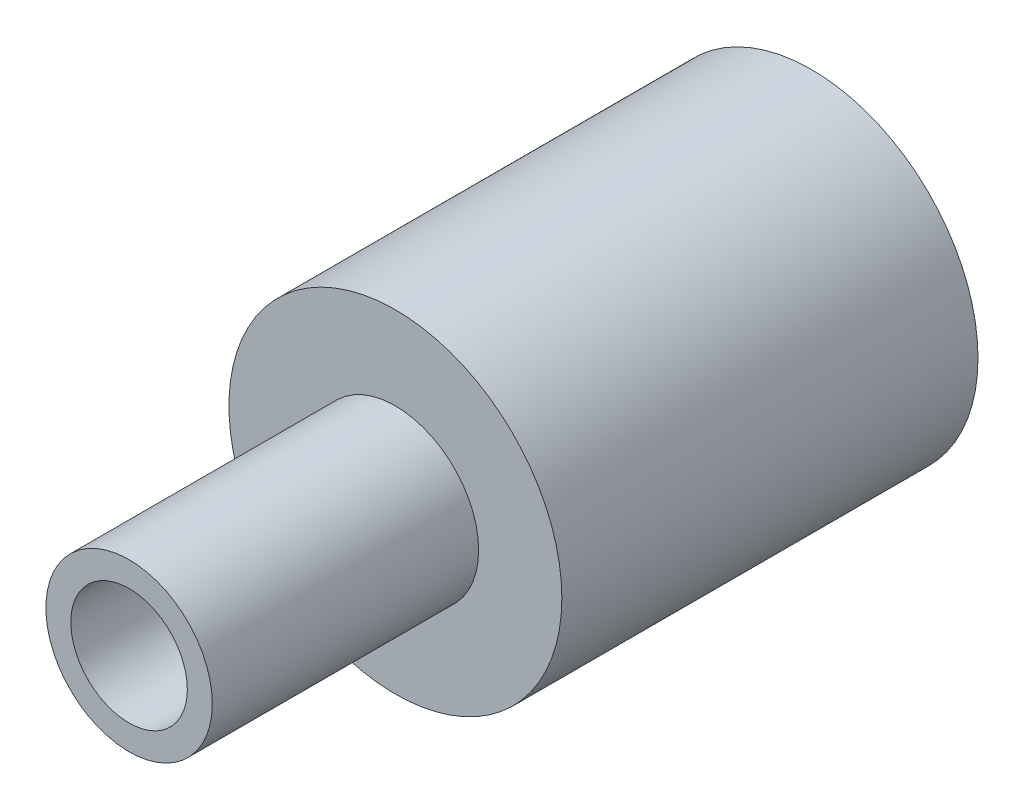
ISO-10303-21;
HEADER;
FILE_DESCRIPTION(('STEP AP214'),'2;1');
FILE_NAME('part.step','',(''),(''),'','','');
FILE_SCHEMA(('AUTOMOTIVE_DESIGN { 1 0 10303 214 1 1 1 1 }'));
ENDSEC;
DATA;
#1=APPLICATION_CONTEXT('core data for automotive mechanical design processes');
#2=APPLICATION_PROTOCOL_DEFINITION('international standard','automotive_design',2000,#1);
#3=PRODUCT_CONTEXT('',#1,'mechanical');
#4=PRODUCT('Part','Part','',(#3));
#5=PRODUCT_RELATED_PRODUCT_CATEGORY('part','',(#4));
#6=PRODUCT_DEFINITION_FORMATION('','',#4);
#7=PRODUCT_DEFINITION_CONTEXT('part definition',#1,'design');
#8=PRODUCT_DEFINITION('design','',#6,#7);
#9=PRODUCT_DEFINITION_SHAPE('','',#8);
#10=(LENGTH_UNIT() NAMED_UNIT(*) SI_UNIT(.MILLI.,.METRE.));
#11=(NAMED_UNIT(*) PLANE_ANGLE_UNIT() SI_UNIT($,.RADIAN.));
#12=(NAMED_UNIT(*) SI_UNIT($,.STERADIAN.) SOLID_ANGLE_UNIT());
#13=UNCERTAINTY_MEASURE_WITH_UNIT(LENGTH_MEASURE(1.E-05),#10,'distance_accuracy_value','');
#14=(GEOMETRIC_REPRESENTATION_CONTEXT(3) GLOBAL_UNCERTAINTY_ASSIGNED_CONTEXT((#13)) GLOBAL_UNIT_ASSIGNED_CONTEXT((#10,
#11,#12)) REPRESENTATION_CONTEXT('',''));
#15=CARTESIAN_POINT('',(0.,0.,0.));
#16=DIRECTION('',(0.,0.,1.));
#17=DIRECTION('',(1.,0.,0.));
#18=AXIS2_PLACEMENT_3D('',#15,#16,#17);
#19=CARTESIAN_POINT('',(0.,0.,41.));
#20=DIRECTION('',(0.,0.,-1.));
#21=DIRECTION('',(-1.,0.,0.));
#22=AXIS2_PLACEMENT_3D('',#19,#20,#21);
#23=CYLINDRICAL_SURFACE('',#22,10.);
#24=CARTESIAN_POINT('',(0.,0.,0.));
#25=DIRECTION('',(0.,0.,1.));
#26=DIRECTION('',(1.,0.,0.));
#27=AXIS2_PLACEMENT_3D('',#24,#25,#26);
#28=CIRCLE('',#27,10.);
#29=CARTESIAN_POINT('',(10.,0.,0.));
#30=VERTEX_POINT('',#29);
#31=EDGE_CURVE('E11',#30,#30,#28,.T.);
#32=ORIENTED_EDGE('',*,*,#31,.T.);
#33=EDGE_LOOP('',(#32));
#34=FACE_BOUND('',#33,.T.);
#35=CARTESIAN_POINT('',(0.,0.,25.));
#36=DIRECTION('',(0.,0.,1.));
#37=DIRECTION('',(1.,0.,0.));
#38=AXIS2_PLACEMENT_3D('',#35,#36,#37);
#39=CIRCLE('',#38,10.);
#40=CARTESIAN_POINT('',(10.,0.,25.));
#41=VERTEX_POINT('',#40);
#42=EDGE_CURVE('E38',#41,#41,#39,.T.);
#43=ORIENTED_EDGE('',*,*,#42,.F.);
#44=EDGE_LOOP('',(#43));
#45=FACE_BOUND('',#44,.T.);
#46=ADVANCED_FACE('F35',(#34,#45),#23,.T.);
#47=CARTESIAN_POINT('',(0.,0.,0.));
#48=DIRECTION('',(0.,0.,1.));
#49=DIRECTION('',(1.,0.,0.));
#50=AXIS2_PLACEMENT_3D('',#47,#48,#49);
#51=PLANE('',#50);
#52=CARTESIAN_POINT('',(0.,0.,0.));
#53=DIRECTION('',(0.,0.,-1.));
#54=DIRECTION('',(-1.,0.,0.));
#55=AXIS2_PLACEMENT_3D('',#52,#53,#54);
#56=CIRCLE('',#55,5.);
#57=CARTESIAN_POINT('',(-5.,0.,0.));
#58=VERTEX_POINT('',#57);
#59=EDGE_CURVE('E46',#58,#58,#56,.T.);
#60=ORIENTED_EDGE('',*,*,#59,.F.);
#61=EDGE_LOOP('',(#60));
#62=FACE_BOUND('',#61,.T.);
#63=ORIENTED_EDGE('',*,*,#31,.F.);
#64=EDGE_LOOP('',(#63));
#65=FACE_BOUND('',#64,.T.);
#66=ADVANCED_FACE('F90',(#62,#65),#51,.F.);
#67=CARTESIAN_POINT('',(0.,0.,10.));
#68=DIRECTION('',(0.,0.,-1.));
#69=DIRECTION('',(-1.,0.,0.));
#70=AXIS2_PLACEMENT_3D('',#67,#68,#69);
#71=CYLINDRICAL_SURFACE('',#70,5.);
#72=CARTESIAN_POINT('',(0.,0.,10.));
#73=DIRECTION('',(0.,0.,-1.));
#74=DIRECTION('',(-1.,0.,0.));
#75=AXIS2_PLACEMENT_3D('',#72,#73,#74);
#76=CIRCLE('',#75,5.);
#77=CARTESIAN_POINT('',(-5.,0.,10.));
#78=VERTEX_POINT('',#77);
#79=EDGE_CURVE('E42',#78,#78,#76,.T.);
#80=ORIENTED_EDGE('',*,*,#79,.F.);
#81=EDGE_LOOP('',(#80));
#82=FACE_BOUND('',#81,.T.);
#83=ORIENTED_EDGE('',*,*,#59,.T.);
#84=EDGE_LOOP('',(#83));
#85=FACE_BOUND('',#84,.T.);
#86=ADVANCED_FACE('F94',(#82,#85),#71,.F.);
#87=CARTESIAN_POINT('',(0.,0.,10.));
#88=DIRECTION('',(0.,0.,-1.));
#89=DIRECTION('',(-1.,0.,0.));
#90=AXIS2_PLACEMENT_3D('',#87,#88,#89);
#91=PLANE('',#90);
#92=ORIENTED_EDGE('',*,*,#79,.T.);
#93=EDGE_LOOP('',(#92));
#94=FACE_BOUND('',#93,.T.);
#95=ADVANCED_FACE('F86',(#94),#91,.T.);
#96=CARTESIAN_POINT('',(0.,0.,25.));
#97=DIRECTION('',(0.,0.,1.));
#98=DIRECTION('',(1.,0.,0.));
#99=AXIS2_PLACEMENT_3D('',#96,#97,#98);
#100=PLANE('',#99);
#101=CARTESIAN_POINT('',(0.,0.,25.));
#102=DIRECTION('',(0.,0.,1.));
#103=DIRECTION('',(1.,0.,0.));
#104=AXIS2_PLACEMENT_3D('',#101,#102,#103);
#105=CIRCLE('',#104,5.);
#106=CARTESIAN_POINT('',(5.,0.,25.));
#107=VERTEX_POINT('',#106);
#108=EDGE_CURVE('E54',#107,#107,#105,.T.);
#109=ORIENTED_EDGE('',*,*,#108,.F.);
#110=EDGE_LOOP('',(#109));
#111=FACE_BOUND('',#110,.T.);
#112=ORIENTED_EDGE('',*,*,#42,.T.);
#113=EDGE_LOOP('',(#112));
#114=FACE_BOUND('',#113,.T.);
#115=ADVANCED_FACE('F80',(#111,#114),#100,.T.);
#116=CARTESIAN_POINT('',(0.,0.,25.));
#117=DIRECTION('',(0.,0.,1.));
#118=DIRECTION('',(1.,0.,0.));
#119=AXIS2_PLACEMENT_3D('',#116,#117,#118);
#120=CYLINDRICAL_SURFACE('',#119,5.);
#121=ORIENTED_EDGE('',*,*,#108,.T.);
#122=EDGE_LOOP('',(#121));
#123=FACE_BOUND('',#122,.T.);
#124=CARTESIAN_POINT('',(0.,0.,41.));
#125=DIRECTION('',(0.,0.,1.));
#126=DIRECTION('',(1.,0.,0.));
#127=AXIS2_PLACEMENT_3D('',#124,#125,#126);
#128=CIRCLE('',#127,5.);
#129=CARTESIAN_POINT('',(5.,0.,41.));
#130=VERTEX_POINT('',#129);
#131=EDGE_CURVE('E51',#130,#130,#128,.T.);
#132=ORIENTED_EDGE('',*,*,#131,.F.);
#133=EDGE_LOOP('',(#132));
#134=FACE_BOUND('',#133,.T.);
#135=ADVANCED_FACE('F75',(#123,#134),#120,.T.);
#136=CARTESIAN_POINT('',(0.,0.,41.));
#137=DIRECTION('',(0.,0.,1.));
#138=DIRECTION('',(1.,0.,0.));
#139=AXIS2_PLACEMENT_3D('',#136,#137,#138);
#140=PLANE('',#139);
#141=CARTESIAN_POINT('',(0.,0.,41.));
#142=DIRECTION('',(0.,0.,1.));
#143=DIRECTION('',(1.,0.,0.));
#144=AXIS2_PLACEMENT_3D('',#141,#142,#143);
#145=CIRCLE('',#144,3.5);
#146=CARTESIAN_POINT('',(3.5,0.,41.));
#147=VERTEX_POINT('',#146);
#148=EDGE_CURVE('E58',#147,#147,#145,.T.);
#149=ORIENTED_EDGE('',*,*,#148,.F.);
#150=EDGE_LOOP('',(#149));
#151=FACE_BOUND('',#150,.T.);
#152=ORIENTED_EDGE('',*,*,#131,.T.);
#153=EDGE_LOOP('',(#152));
#154=FACE_BOUND('',#153,.T.);
#155=ADVANCED_FACE('F69',(#151,#154),#140,.T.);
#156=CARTESIAN_POINT('',(0.,0.,29.));
#157=DIRECTION('',(0.,0.,1.));
#158=DIRECTION('',(1.,0.,0.));
#159=AXIS2_PLACEMENT_3D('',#156,#157,#158);
#160=CYLINDRICAL_SURFACE('',#159,3.5);
#161=CARTESIAN_POINT('',(0.,0.,29.));
#162=DIRECTION('',(0.,0.,1.));
#163=DIRECTION('',(1.,0.,0.));
#164=AXIS2_PLACEMENT_3D('',#161,#162,#163);
#165=CIRCLE('',#164,3.5);
#166=CARTESIAN_POINT('',(3.5,0.,29.));
#167=VERTEX_POINT('',#166);
#168=EDGE_CURVE('E55',#167,#167,#165,.T.);
#169=ORIENTED_EDGE('',*,*,#168,.F.);
#170=EDGE_LOOP('',(#169));
#171=FACE_BOUND('',#170,.T.);
#172=ORIENTED_EDGE('',*,*,#148,.T.);
#173=EDGE_LOOP('',(#172));
#174=FACE_BOUND('',#173,.T.);
#175=ADVANCED_FACE('F66',(#171,#174),#160,.F.);
#176=CARTESIAN_POINT('',(0.,0.,29.));
#177=DIRECTION('',(0.,0.,1.));
#178=DIRECTION('',(1.,0.,0.));
#179=AXIS2_PLACEMENT_3D('',#176,#177,#178);
#180=PLANE('',#179);
#181=ORIENTED_EDGE('',*,*,#168,.T.);
#182=EDGE_LOOP('',(#181));
#183=FACE_BOUND('',#182,.T.);
#184=ADVANCED_FACE('F64',(#183),#180,.T.);
#185=CLOSED_SHELL('',(#46,#66,#86,#95,#115,#135,#155,#175,#184));
#186=MANIFOLD_SOLID_BREP('B2',#185);
#187=ADVANCED_BREP_SHAPE_REPRESENTATION('',(#18,#186),#14);
#188=SHAPE_DEFINITION_REPRESENTATION(#9,#187);
ENDSEC;
END-ISO-10303-21;
